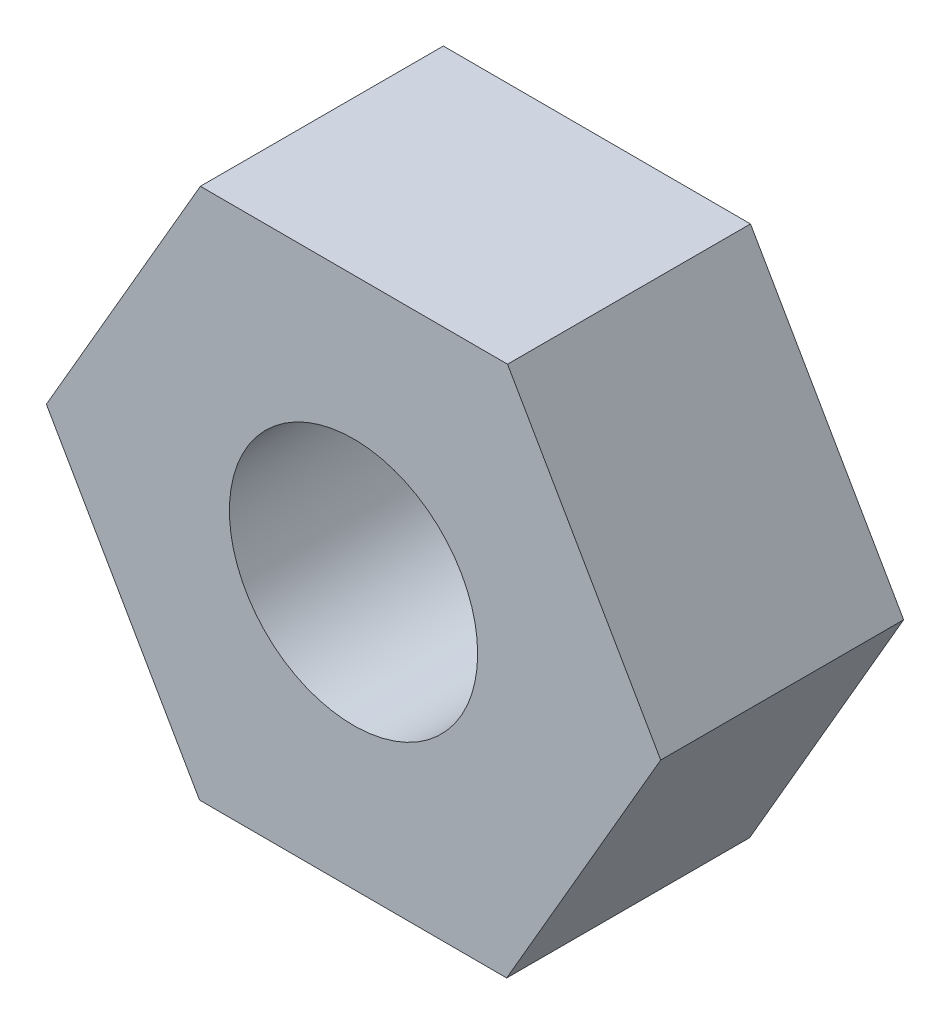
ISO-10303-21;
HEADER;
FILE_DESCRIPTION(('STEP AP214'),'2;1');
FILE_NAME('part.step','',(''),(''),'','','');
FILE_SCHEMA(('AUTOMOTIVE_DESIGN { 1 0 10303 214 1 1 1 1 }'));
ENDSEC;
DATA;
#1=APPLICATION_CONTEXT('core data for automotive mechanical design processes');
#2=APPLICATION_PROTOCOL_DEFINITION('international standard','automotive_design',2000,#1);
#3=PRODUCT_CONTEXT('',#1,'mechanical');
#4=PRODUCT('Part','Part','',(#3));
#5=PRODUCT_RELATED_PRODUCT_CATEGORY('part','',(#4));
#6=PRODUCT_DEFINITION_FORMATION('','',#4);
#7=PRODUCT_DEFINITION_CONTEXT('part definition',#1,'design');
#8=PRODUCT_DEFINITION('design','',#6,#7);
#9=PRODUCT_DEFINITION_SHAPE('','',#8);
#10=(LENGTH_UNIT() NAMED_UNIT(*) SI_UNIT(.MILLI.,.METRE.));
#11=(NAMED_UNIT(*) PLANE_ANGLE_UNIT() SI_UNIT($,.RADIAN.));
#12=(NAMED_UNIT(*) SI_UNIT($,.STERADIAN.) SOLID_ANGLE_UNIT());
#13=UNCERTAINTY_MEASURE_WITH_UNIT(LENGTH_MEASURE(1.E-05),#10,'distance_accuracy_value','');
#14=(GEOMETRIC_REPRESENTATION_CONTEXT(3) GLOBAL_UNCERTAINTY_ASSIGNED_CONTEXT((#13)) GLOBAL_UNIT_ASSIGNED_CONTEXT((#10,
#11,#12)) REPRESENTATION_CONTEXT('',''));
#15=CARTESIAN_POINT('',(0.,0.,0.));
#16=DIRECTION('',(0.,0.,1.));
#17=DIRECTION('',(1.,0.,0.));
#18=AXIS2_PLACEMENT_3D('',#15,#16,#17);
#19=CARTESIAN_POINT('',(2.20595645834549,3.80638359915075,3.4798));
#20=DIRECTION('',(-0.00164170526315382,-0.999998652401006,0.));
#21=DIRECTION('',(0.999998652401006,-0.00164170526315382,0.));
#22=AXIS2_PLACEMENT_3D('',#19,#20,#21);
#23=PLANE('',#22);
#24=DIRECTION('',(-0.999998652401006,0.00164170526315382,0.));
#25=VECTOR('',#24,1.);
#26=CARTESIAN_POINT('',(2.20595645834549,3.80638359915075,0.));
#27=LINE('',#26,#25);
#28=CARTESIAN_POINT('',(2.20595645834549,3.80638359915075,0.));
#29=VERTEX_POINT('',#28);
#30=CARTESIAN_POINT('',(-2.19344666424025,3.81360613214492,0.));
#31=VERTEX_POINT('',#30);
#32=EDGE_CURVE('E118',#29,#31,#27,.T.);
#33=ORIENTED_EDGE('',*,*,#32,.T.);
#34=DIRECTION('',(0.,0.,-1.));
#35=VECTOR('',#34,1.);
#36=CARTESIAN_POINT('',(-2.19344666424025,3.81360613214492,3.4798));
#37=LINE('',#36,#35);
#38=CARTESIAN_POINT('',(-2.19344666424025,3.81360613214492,3.4798));
#39=VERTEX_POINT('',#38);
#40=EDGE_CURVE('E11',#39,#31,#37,.T.);
#41=ORIENTED_EDGE('',*,*,#40,.F.);
#42=DIRECTION('',(-0.999998652401006,0.00164170526315382,0.));
#43=VECTOR('',#42,1.);
#44=CARTESIAN_POINT('',(2.20595645834549,3.80638359915075,3.4798));
#45=LINE('',#44,#43);
#46=CARTESIAN_POINT('',(2.20595645834549,3.80638359915075,3.4798));
#47=VERTEX_POINT('',#46);
#48=EDGE_CURVE('E129',#47,#39,#45,.T.);
#49=ORIENTED_EDGE('',*,*,#48,.F.);
#50=DIRECTION('',(0.,0.,-1.));
#51=VECTOR('',#50,1.);
#52=CARTESIAN_POINT('',(2.20595645834549,3.80638359915075,3.4798));
#53=LINE('',#52,#51);
#54=EDGE_CURVE('E114',#47,#29,#53,.T.);
#55=ORIENTED_EDGE('',*,*,#54,.T.);
#56=EDGE_LOOP('',(#33,#41,#49,#55));
#57=FACE_BOUND('',#56,.T.);
#58=ADVANCED_FACE('F34',(#57),#23,.F.);
#59=CARTESIAN_POINT('',(-2.19344666424025,3.81360613214492,3.4798));
#60=DIRECTION('',(0.865203384097899,-0.501421084663921,0.));
#61=DIRECTION('',(0.501421084663921,0.8652033840979,0.));
#62=AXIS2_PLACEMENT_3D('',#59,#60,#61);
#63=PLANE('',#62);
#64=DIRECTION('',(-0.501421084663921,-0.865203384097899,0.));
#65=VECTOR('',#64,1.);
#66=CARTESIAN_POINT('',(-2.19344666424025,3.81360613214492,0.));
#67=LINE('',#66,#65);
#68=CARTESIAN_POINT('',(-4.39940312258574,0.00722253299416211,0.));
#69=VERTEX_POINT('',#68);
#70=EDGE_CURVE('E121',#31,#69,#67,.T.);
#71=ORIENTED_EDGE('',*,*,#70,.T.);
#72=DIRECTION('',(0.,0.,-1.));
#73=VECTOR('',#72,1.);
#74=CARTESIAN_POINT('',(-4.39940312258574,0.00722253299416211,3.4798));
#75=LINE('',#74,#73);
#76=CARTESIAN_POINT('',(-4.39940312258574,0.00722253299416211,3.4798));
#77=VERTEX_POINT('',#76);
#78=EDGE_CURVE('E42',#77,#69,#75,.T.);
#79=ORIENTED_EDGE('',*,*,#78,.F.);
#80=DIRECTION('',(-0.501421084663921,-0.865203384097899,0.));
#81=VECTOR('',#80,1.);
#82=CARTESIAN_POINT('',(-2.19344666424025,3.81360613214492,3.4798));
#83=LINE('',#82,#81);
#84=EDGE_CURVE('E87',#39,#77,#83,.T.);
#85=ORIENTED_EDGE('',*,*,#84,.F.);
#86=ORIENTED_EDGE('',*,*,#40,.T.);
#87=EDGE_LOOP('',(#71,#79,#85,#86));
#88=FACE_BOUND('',#87,.T.);
#89=ADVANCED_FACE('F154',(#88),#63,.F.);
#90=CARTESIAN_POINT('',(-4.39940312258574,0.00722253299416211,3.4798));
#91=DIRECTION('',(0.866845089361053,0.498577567737085,0.));
#92=DIRECTION('',(-0.498577567737085,0.866845089361053,0.));
#93=AXIS2_PLACEMENT_3D('',#90,#91,#92);
#94=PLANE('',#93);
#95=DIRECTION('',(0.498577567737085,-0.866845089361053,0.));
#96=VECTOR('',#95,1.);
#97=CARTESIAN_POINT('',(-4.39940312258574,0.00722253299416211,0.));
#98=LINE('',#97,#96);
#99=CARTESIAN_POINT('',(-2.20595645834548,-3.80638359915075,0.));
#100=VERTEX_POINT('',#99);
#101=EDGE_CURVE('E124',#69,#100,#98,.T.);
#102=ORIENTED_EDGE('',*,*,#101,.T.);
#103=DIRECTION('',(0.,0.,-1.));
#104=VECTOR('',#103,1.);
#105=CARTESIAN_POINT('',(-2.20595645834548,-3.80638359915075,3.4798));
#106=LINE('',#105,#104);
#107=CARTESIAN_POINT('',(-2.20595645834548,-3.80638359915075,3.4798));
#108=VERTEX_POINT('',#107);
#109=EDGE_CURVE('E109',#108,#100,#106,.T.);
#110=ORIENTED_EDGE('',*,*,#109,.F.);
#111=DIRECTION('',(0.498577567737085,-0.866845089361053,0.));
#112=VECTOR('',#111,1.);
#113=CARTESIAN_POINT('',(-4.39940312258574,0.00722253299416211,3.4798));
#114=LINE('',#113,#112);
#115=EDGE_CURVE('E100',#77,#108,#114,.T.);
#116=ORIENTED_EDGE('',*,*,#115,.F.);
#117=ORIENTED_EDGE('',*,*,#78,.T.);
#118=EDGE_LOOP('',(#102,#110,#116,#117));
#119=FACE_BOUND('',#118,.T.);
#120=ADVANCED_FACE('F135',(#119),#94,.F.);
#121=CARTESIAN_POINT('',(-2.20595645834548,-3.80638359915075,3.4798));
#122=DIRECTION('',(0.00164170526315382,0.999998652401006,0.));
#123=DIRECTION('',(-0.999998652401007,0.00164170526315382,0.));
#124=AXIS2_PLACEMENT_3D('',#121,#122,#123);
#125=PLANE('',#124);
#126=DIRECTION('',(0.999998652401006,-0.00164170526315382,0.));
#127=VECTOR('',#126,1.);
#128=CARTESIAN_POINT('',(-2.20595645834548,-3.80638359915075,0.));
#129=LINE('',#128,#127);
#130=CARTESIAN_POINT('',(2.19344666424025,-3.81360613214492,0.));
#131=VERTEX_POINT('',#130);
#132=EDGE_CURVE('E108',#100,#131,#129,.T.);
#133=ORIENTED_EDGE('',*,*,#132,.T.);
#134=DIRECTION('',(0.,0.,-1.));
#135=VECTOR('',#134,1.);
#136=CARTESIAN_POINT('',(2.19344666424025,-3.81360613214492,3.4798));
#137=LINE('',#136,#135);
#138=CARTESIAN_POINT('',(2.19344666424025,-3.81360613214492,3.4798));
#139=VERTEX_POINT('',#138);
#140=EDGE_CURVE('E105',#139,#131,#137,.T.);
#141=ORIENTED_EDGE('',*,*,#140,.F.);
#142=DIRECTION('',(0.999998652401006,-0.00164170526315382,0.));
#143=VECTOR('',#142,1.);
#144=CARTESIAN_POINT('',(-2.20595645834548,-3.80638359915075,3.4798));
#145=LINE('',#144,#143);
#146=EDGE_CURVE('E94',#108,#139,#145,.T.);
#147=ORIENTED_EDGE('',*,*,#146,.F.);
#148=ORIENTED_EDGE('',*,*,#109,.T.);
#149=EDGE_LOOP('',(#133,#141,#147,#148));
#150=FACE_BOUND('',#149,.T.);
#151=ADVANCED_FACE('F106',(#150),#125,.F.);
#152=CARTESIAN_POINT('',(2.19344666424025,-3.81360613214492,3.4798));
#153=DIRECTION('',(-0.865203384097899,0.501421084663921,0.));
#154=DIRECTION('',(-0.501421084663921,-0.865203384097899,0.));
#155=AXIS2_PLACEMENT_3D('',#152,#153,#154);
#156=PLANE('',#155);
#157=DIRECTION('',(0.501421084663921,0.865203384097899,0.));
#158=VECTOR('',#157,1.);
#159=CARTESIAN_POINT('',(2.19344666424025,-3.81360613214492,0.));
#160=LINE('',#159,#158);
#161=CARTESIAN_POINT('',(4.39940312258574,-0.00722253299416309,0.));
#162=VERTEX_POINT('',#161);
#163=EDGE_CURVE('E73',#131,#162,#160,.T.);
#164=ORIENTED_EDGE('',*,*,#163,.T.);
#165=DIRECTION('',(0.,0.,-1.));
#166=VECTOR('',#165,1.);
#167=CARTESIAN_POINT('',(4.39940312258574,-0.00722253299416309,3.4798));
#168=LINE('',#167,#166);
#169=CARTESIAN_POINT('',(4.39940312258574,-0.00722253299416309,3.4798));
#170=VERTEX_POINT('',#169);
#171=EDGE_CURVE('E110',#170,#162,#168,.T.);
#172=ORIENTED_EDGE('',*,*,#171,.F.);
#173=DIRECTION('',(0.501421084663921,0.865203384097899,0.));
#174=VECTOR('',#173,1.);
#175=CARTESIAN_POINT('',(2.19344666424025,-3.81360613214492,3.4798));
#176=LINE('',#175,#174);
#177=EDGE_CURVE('E98',#139,#170,#176,.T.);
#178=ORIENTED_EDGE('',*,*,#177,.F.);
#179=ORIENTED_EDGE('',*,*,#140,.T.);
#180=EDGE_LOOP('',(#164,#172,#178,#179));
#181=FACE_BOUND('',#180,.T.);
#182=ADVANCED_FACE('F112',(#181),#156,.F.);
#183=CARTESIAN_POINT('',(4.39940312258574,-0.00722253299416309,3.4798));
#184=DIRECTION('',(-0.866845089361053,-0.498577567737085,0.));
#185=DIRECTION('',(0.498577567737085,-0.866845089361053,0.));
#186=AXIS2_PLACEMENT_3D('',#183,#184,#185);
#187=PLANE('',#186);
#188=DIRECTION('',(-0.498577567737085,0.866845089361053,0.));
#189=VECTOR('',#188,1.);
#190=CARTESIAN_POINT('',(4.39940312258574,-0.00722253299416309,0.));
#191=LINE('',#190,#189);
#192=EDGE_CURVE('E79',#162,#29,#191,.T.);
#193=ORIENTED_EDGE('',*,*,#192,.T.);
#194=ORIENTED_EDGE('',*,*,#54,.F.);
#195=DIRECTION('',(-0.498577567737085,0.866845089361053,0.));
#196=VECTOR('',#195,1.);
#197=CARTESIAN_POINT('',(4.39940312258574,-0.00722253299416309,3.4798));
#198=LINE('',#197,#196);
#199=EDGE_CURVE('E50',#170,#47,#198,.T.);
#200=ORIENTED_EDGE('',*,*,#199,.F.);
#201=ORIENTED_EDGE('',*,*,#171,.T.);
#202=EDGE_LOOP('',(#193,#194,#200,#201));
#203=FACE_BOUND('',#202,.T.);
#204=ADVANCED_FACE('F142',(#203),#187,.F.);
#205=CARTESIAN_POINT('',(0.,0.,3.4798));
#206=DIRECTION('',(0.,0.,1.));
#207=DIRECTION('',(1.,0.,0.));
#208=AXIS2_PLACEMENT_3D('',#205,#206,#207);
#209=PLANE('',#208);
#210=CARTESIAN_POINT('',(0.,0.,3.4798));
#211=DIRECTION('',(0.,0.,1.));
#212=DIRECTION('',(1.,0.,0.));
#213=AXIS2_PLACEMENT_3D('',#210,#211,#212);
#214=CIRCLE('',#213,1.778);
#215=CARTESIAN_POINT('',(1.778,0.,3.4798));
#216=VERTEX_POINT('',#215);
#217=EDGE_CURVE('E209',#216,#216,#214,.T.);
#218=ORIENTED_EDGE('',*,*,#217,.F.);
#219=EDGE_LOOP('',(#218));
#220=FACE_BOUND('',#219,.T.);
#221=ORIENTED_EDGE('',*,*,#48,.T.);
#222=ORIENTED_EDGE('',*,*,#84,.T.);
#223=ORIENTED_EDGE('',*,*,#115,.T.);
#224=ORIENTED_EDGE('',*,*,#146,.T.);
#225=ORIENTED_EDGE('',*,*,#177,.T.);
#226=ORIENTED_EDGE('',*,*,#199,.T.);
#227=EDGE_LOOP('',(#221,#222,#223,#224,#225,#226));
#228=FACE_BOUND('',#227,.T.);
#229=ADVANCED_FACE('F96',(#220,#228),#209,.T.);
#230=CARTESIAN_POINT('',(0.,0.,0.));
#231=DIRECTION('',(0.,0.,1.));
#232=DIRECTION('',(1.,0.,0.));
#233=AXIS2_PLACEMENT_3D('',#230,#231,#232);
#234=PLANE('',#233);
#235=CARTESIAN_POINT('',(0.,0.,0.));
#236=DIRECTION('',(0.,0.,1.));
#237=DIRECTION('',(1.,0.,0.));
#238=AXIS2_PLACEMENT_3D('',#235,#236,#237);
#239=CIRCLE('',#238,1.778);
#240=CARTESIAN_POINT('',(1.778,0.,0.));
#241=VERTEX_POINT('',#240);
#242=EDGE_CURVE('E122',#241,#241,#239,.T.);
#243=ORIENTED_EDGE('',*,*,#242,.T.);
#244=EDGE_LOOP('',(#243));
#245=FACE_BOUND('',#244,.T.);
#246=ORIENTED_EDGE('',*,*,#32,.F.);
#247=ORIENTED_EDGE('',*,*,#192,.F.);
#248=ORIENTED_EDGE('',*,*,#163,.F.);
#249=ORIENTED_EDGE('',*,*,#132,.F.);
#250=ORIENTED_EDGE('',*,*,#101,.F.);
#251=ORIENTED_EDGE('',*,*,#70,.F.);
#252=EDGE_LOOP('',(#246,#247,#248,#249,#250,#251));
#253=FACE_BOUND('',#252,.T.);
#254=ADVANCED_FACE('F138',(#245,#253),#234,.F.);
#255=CARTESIAN_POINT('',(0.,0.,0.));
#256=DIRECTION('',(0.,0.,1.));
#257=DIRECTION('',(1.,0.,0.));
#258=AXIS2_PLACEMENT_3D('',#255,#256,#257);
#259=CYLINDRICAL_SURFACE('',#258,1.778);
#260=ORIENTED_EDGE('',*,*,#242,.F.);
#261=EDGE_LOOP('',(#260));
#262=FACE_BOUND('',#261,.T.);
#263=ORIENTED_EDGE('',*,*,#217,.T.);
#264=EDGE_LOOP('',(#263));
#265=FACE_BOUND('',#264,.T.);
#266=ADVANCED_FACE('F191',(#262,#265),#259,.F.);
#267=CLOSED_SHELL('',(#58,#89,#120,#151,#182,#204,#229,#254,#266));
#268=MANIFOLD_SOLID_BREP('B2',#267);
#269=ADVANCED_BREP_SHAPE_REPRESENTATION('',(#18,#268),#14);
#270=SHAPE_DEFINITION_REPRESENTATION(#9,#269);
ENDSEC;
END-ISO-10303-21;
